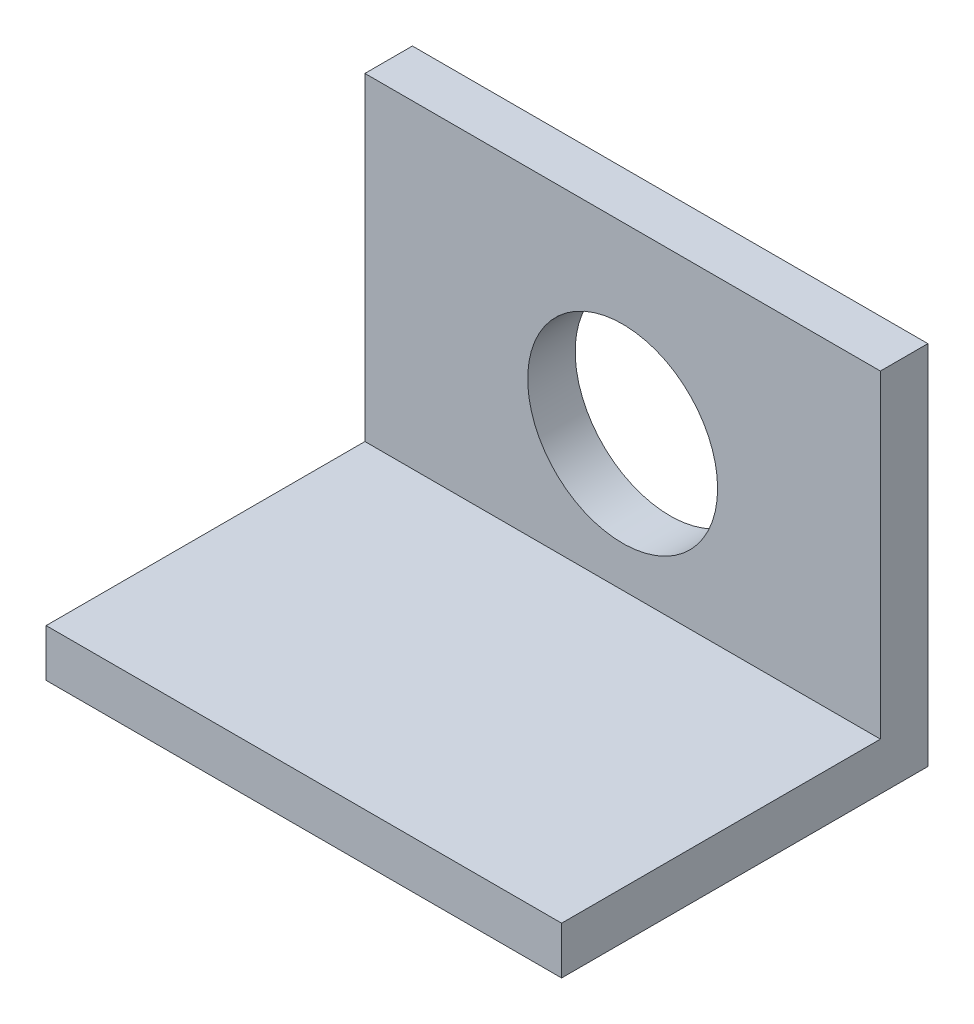
ISO-10303-21;
HEADER;
FILE_DESCRIPTION(('STEP AP214'),'2;1');
FILE_NAME('part.step','',(''),(''),'','','');
FILE_SCHEMA(('AUTOMOTIVE_DESIGN { 1 0 10303 214 1 1 1 1 }'));
ENDSEC;
DATA;
#1=APPLICATION_CONTEXT('core data for automotive mechanical design processes');
#2=APPLICATION_PROTOCOL_DEFINITION('international standard','automotive_design',2000,#1);
#3=PRODUCT_CONTEXT('',#1,'mechanical');
#4=PRODUCT('Part','Part','',(#3));
#5=PRODUCT_RELATED_PRODUCT_CATEGORY('part','',(#4));
#6=PRODUCT_DEFINITION_FORMATION('','',#4);
#7=PRODUCT_DEFINITION_CONTEXT('part definition',#1,'design');
#8=PRODUCT_DEFINITION('design','',#6,#7);
#9=PRODUCT_DEFINITION_SHAPE('','',#8);
#10=(LENGTH_UNIT() NAMED_UNIT(*) SI_UNIT(.MILLI.,.METRE.));
#11=(NAMED_UNIT(*) PLANE_ANGLE_UNIT() SI_UNIT($,.RADIAN.));
#12=(NAMED_UNIT(*) SI_UNIT($,.STERADIAN.) SOLID_ANGLE_UNIT());
#13=UNCERTAINTY_MEASURE_WITH_UNIT(LENGTH_MEASURE(1.E-05),#10,'distance_accuracy_value','');
#14=(GEOMETRIC_REPRESENTATION_CONTEXT(3) GLOBAL_UNCERTAINTY_ASSIGNED_CONTEXT((#13)) GLOBAL_UNIT_ASSIGNED_CONTEXT((#10,
#11,#12)) REPRESENTATION_CONTEXT('',''));
#15=CARTESIAN_POINT('',(0.,0.,0.));
#16=DIRECTION('',(0.,0.,1.));
#17=DIRECTION('',(1.,0.,0.));
#18=AXIS2_PLACEMENT_3D('',#15,#16,#17);
#19=CARTESIAN_POINT('',(19.,0.,3.5));
#20=DIRECTION('',(1.,0.,0.));
#21=DIRECTION('',(0.,1.,0.));
#22=AXIS2_PLACEMENT_3D('',#19,#20,#21);
#23=PLANE('',#22);
#24=DIRECTION('',(0.,-1.,0.));
#25=VECTOR('',#24,1.);
#26=CARTESIAN_POINT('',(19.,0.,0.));
#27=LINE('',#26,#25);
#28=CARTESIAN_POINT('',(19.,27.,0.));
#29=VERTEX_POINT('',#28);
#30=CARTESIAN_POINT('',(19.,0.,0.));
#31=VERTEX_POINT('',#30);
#32=EDGE_CURVE('E83',#29,#31,#27,.T.);
#33=ORIENTED_EDGE('',*,*,#32,.F.);
#34=DIRECTION('',(0.,0.,-1.));
#35=VECTOR('',#34,1.);
#36=CARTESIAN_POINT('',(19.,27.,3.5));
#37=LINE('',#36,#35);
#38=CARTESIAN_POINT('',(19.,27.,3.5));
#39=VERTEX_POINT('',#38);
#40=EDGE_CURVE('E11',#39,#29,#37,.T.);
#41=ORIENTED_EDGE('',*,*,#40,.F.);
#42=DIRECTION('',(0.,-1.,0.));
#43=VECTOR('',#42,1.);
#44=CARTESIAN_POINT('',(19.,0.,3.5));
#45=LINE('',#44,#43);
#46=CARTESIAN_POINT('',(19.,3.5,3.5));
#47=VERTEX_POINT('',#46);
#48=EDGE_CURVE('E80',#39,#47,#45,.T.);
#49=ORIENTED_EDGE('',*,*,#48,.T.);
#50=DIRECTION('',(0.,0.,-1.));
#51=VECTOR('',#50,1.);
#52=CARTESIAN_POINT('',(19.,3.5,27.));
#53=LINE('',#52,#51);
#54=CARTESIAN_POINT('',(19.,3.5,27.));
#55=VERTEX_POINT('',#54);
#56=EDGE_CURVE('E52',#55,#47,#53,.T.);
#57=ORIENTED_EDGE('',*,*,#56,.F.);
#58=DIRECTION('',(0.,-1.,0.));
#59=VECTOR('',#58,1.);
#60=CARTESIAN_POINT('',(19.,0.,27.));
#61=LINE('',#60,#59);
#62=CARTESIAN_POINT('',(19.,0.,27.));
#63=VERTEX_POINT('',#62);
#64=EDGE_CURVE('E121',#55,#63,#61,.T.);
#65=ORIENTED_EDGE('',*,*,#64,.T.);
#66=DIRECTION('',(0.,0.,-1.));
#67=VECTOR('',#66,1.);
#68=CARTESIAN_POINT('',(19.,0.,27.));
#69=LINE('',#68,#67);
#70=EDGE_CURVE('E130',#63,#31,#69,.T.);
#71=ORIENTED_EDGE('',*,*,#70,.T.);
#72=EDGE_LOOP('',(#33,#41,#49,#57,#65,#71));
#73=FACE_BOUND('',#72,.T.);
#74=ADVANCED_FACE('F35',(#73),#23,.T.);
#75=CARTESIAN_POINT('',(0.,27.,3.5));
#76=DIRECTION('',(0.,1.,0.));
#77=DIRECTION('',(0.,0.,1.));
#78=AXIS2_PLACEMENT_3D('',#75,#76,#77);
#79=PLANE('',#78);
#80=DIRECTION('',(1.,0.,0.));
#81=VECTOR('',#80,1.);
#82=CARTESIAN_POINT('',(0.,27.,0.));
#83=LINE('',#82,#81);
#84=CARTESIAN_POINT('',(-19.,27.,0.));
#85=VERTEX_POINT('',#84);
#86=EDGE_CURVE('E104',#85,#29,#83,.T.);
#87=ORIENTED_EDGE('',*,*,#86,.F.);
#88=DIRECTION('',(0.,0.,-1.));
#89=VECTOR('',#88,1.);
#90=CARTESIAN_POINT('',(-19.,27.,3.5));
#91=LINE('',#90,#89);
#92=CARTESIAN_POINT('',(-19.,27.,3.5));
#93=VERTEX_POINT('',#92);
#94=EDGE_CURVE('E44',#93,#85,#91,.T.);
#95=ORIENTED_EDGE('',*,*,#94,.F.);
#96=DIRECTION('',(1.,0.,0.));
#97=VECTOR('',#96,1.);
#98=CARTESIAN_POINT('',(0.,27.,3.5));
#99=LINE('',#98,#97);
#100=EDGE_CURVE('E89',#93,#39,#99,.T.);
#101=ORIENTED_EDGE('',*,*,#100,.T.);
#102=ORIENTED_EDGE('',*,*,#40,.T.);
#103=EDGE_LOOP('',(#87,#95,#101,#102));
#104=FACE_BOUND('',#103,.T.);
#105=ADVANCED_FACE('F92',(#104),#79,.T.);
#106=CARTESIAN_POINT('',(-19.,0.,3.5));
#107=DIRECTION('',(1.,0.,0.));
#108=DIRECTION('',(0.,0.,-1.));
#109=AXIS2_PLACEMENT_3D('',#106,#107,#108);
#110=PLANE('',#109);
#111=DIRECTION('',(0.,-1.,0.));
#112=VECTOR('',#111,1.);
#113=CARTESIAN_POINT('',(-19.,0.,0.));
#114=LINE('',#113,#112);
#115=CARTESIAN_POINT('',(-19.,0.,0.));
#116=VERTEX_POINT('',#115);
#117=EDGE_CURVE('E106',#85,#116,#114,.T.);
#118=ORIENTED_EDGE('',*,*,#117,.T.);
#119=DIRECTION('',(0.,0.,-1.));
#120=VECTOR('',#119,1.);
#121=CARTESIAN_POINT('',(-19.,0.,27.));
#122=LINE('',#121,#120);
#123=CARTESIAN_POINT('',(-19.,0.,27.));
#124=VERTEX_POINT('',#123);
#125=EDGE_CURVE('E132',#124,#116,#122,.T.);
#126=ORIENTED_EDGE('',*,*,#125,.F.);
#127=DIRECTION('',(0.,-1.,0.));
#128=VECTOR('',#127,1.);
#129=CARTESIAN_POINT('',(-19.,0.,27.));
#130=LINE('',#129,#128);
#131=CARTESIAN_POINT('',(-19.,3.5,27.));
#132=VERTEX_POINT('',#131);
#133=EDGE_CURVE('E228',#132,#124,#130,.T.);
#134=ORIENTED_EDGE('',*,*,#133,.F.);
#135=DIRECTION('',(0.,0.,-1.));
#136=VECTOR('',#135,1.);
#137=CARTESIAN_POINT('',(-19.,3.5,27.));
#138=LINE('',#137,#136);
#139=CARTESIAN_POINT('',(-19.,3.5,3.5));
#140=VERTEX_POINT('',#139);
#141=EDGE_CURVE('E134',#132,#140,#138,.T.);
#142=ORIENTED_EDGE('',*,*,#141,.T.);
#143=DIRECTION('',(0.,-1.,0.));
#144=VECTOR('',#143,1.);
#145=CARTESIAN_POINT('',(-19.,0.,3.5));
#146=LINE('',#145,#144);
#147=EDGE_CURVE('E94',#93,#140,#146,.T.);
#148=ORIENTED_EDGE('',*,*,#147,.F.);
#149=ORIENTED_EDGE('',*,*,#94,.T.);
#150=EDGE_LOOP('',(#118,#126,#134,#142,#148,#149));
#151=FACE_BOUND('',#150,.T.);
#152=ADVANCED_FACE('F110',(#151),#110,.F.);
#153=CARTESIAN_POINT('',(0.,13.5,3.5));
#154=DIRECTION('',(0.,0.,-1.));
#155=DIRECTION('',(-1.,0.,0.));
#156=AXIS2_PLACEMENT_3D('',#153,#154,#155);
#157=CYLINDRICAL_SURFACE('',#156,7.);
#158=CARTESIAN_POINT('',(0.,13.5,3.5));
#159=DIRECTION('',(0.,0.,1.));
#160=DIRECTION('',(1.,0.,0.));
#161=AXIS2_PLACEMENT_3D('',#158,#159,#160);
#162=CIRCLE('',#161,7.);
#163=CARTESIAN_POINT('',(7.,13.5,3.5));
#164=VERTEX_POINT('',#163);
#165=EDGE_CURVE('E90',#164,#164,#162,.T.);
#166=ORIENTED_EDGE('',*,*,#165,.T.);
#167=EDGE_LOOP('',(#166));
#168=FACE_BOUND('',#167,.T.);
#169=CARTESIAN_POINT('',(0.,13.5,0.));
#170=DIRECTION('',(0.,0.,1.));
#171=DIRECTION('',(1.,0.,0.));
#172=AXIS2_PLACEMENT_3D('',#169,#170,#171);
#173=CIRCLE('',#172,7.);
#174=CARTESIAN_POINT('',(7.,13.5,0.));
#175=VERTEX_POINT('',#174);
#176=EDGE_CURVE('E100',#175,#175,#173,.T.);
#177=ORIENTED_EDGE('',*,*,#176,.F.);
#178=EDGE_LOOP('',(#177));
#179=FACE_BOUND('',#178,.T.);
#180=ADVANCED_FACE('F37',(#168,#179),#157,.F.);
#181=CARTESIAN_POINT('',(0.,0.,3.5));
#182=DIRECTION('',(0.,0.,1.));
#183=DIRECTION('',(1.,0.,0.));
#184=AXIS2_PLACEMENT_3D('',#181,#182,#183);
#185=PLANE('',#184);
#186=ORIENTED_EDGE('',*,*,#165,.F.);
#187=EDGE_LOOP('',(#186));
#188=FACE_BOUND('',#187,.T.);
#189=ORIENTED_EDGE('',*,*,#48,.F.);
#190=ORIENTED_EDGE('',*,*,#100,.F.);
#191=ORIENTED_EDGE('',*,*,#147,.T.);
#192=DIRECTION('',(1.,0.,0.));
#193=VECTOR('',#192,1.);
#194=CARTESIAN_POINT('',(0.,3.5,3.5));
#195=LINE('',#194,#193);
#196=EDGE_CURVE('E69',#140,#47,#195,.T.);
#197=ORIENTED_EDGE('',*,*,#196,.T.);
#198=EDGE_LOOP('',(#189,#190,#191,#197));
#199=FACE_BOUND('',#198,.T.);
#200=ADVANCED_FACE('F87',(#188,#199),#185,.T.);
#201=CARTESIAN_POINT('',(0.,0.,0.));
#202=DIRECTION('',(0.,0.,1.));
#203=DIRECTION('',(1.,0.,0.));
#204=AXIS2_PLACEMENT_3D('',#201,#202,#203);
#205=PLANE('',#204);
#206=ORIENTED_EDGE('',*,*,#176,.T.);
#207=EDGE_LOOP('',(#206));
#208=FACE_BOUND('',#207,.T.);
#209=ORIENTED_EDGE('',*,*,#32,.T.);
#210=DIRECTION('',(1.,0.,0.));
#211=VECTOR('',#210,1.);
#212=CARTESIAN_POINT('',(0.,0.,0.));
#213=LINE('',#212,#211);
#214=EDGE_CURVE('E118',#116,#31,#213,.T.);
#215=ORIENTED_EDGE('',*,*,#214,.F.);
#216=ORIENTED_EDGE('',*,*,#117,.F.);
#217=ORIENTED_EDGE('',*,*,#86,.T.);
#218=EDGE_LOOP('',(#209,#215,#216,#217));
#219=FACE_BOUND('',#218,.T.);
#220=ADVANCED_FACE('F116',(#208,#219),#205,.F.);
#221=CARTESIAN_POINT('',(0.,3.5,27.));
#222=DIRECTION('',(0.,1.,0.));
#223=DIRECTION('',(0.,0.,1.));
#224=AXIS2_PLACEMENT_3D('',#221,#222,#223);
#225=PLANE('',#224);
#226=ORIENTED_EDGE('',*,*,#196,.F.);
#227=ORIENTED_EDGE('',*,*,#141,.F.);
#228=DIRECTION('',(1.,0.,0.));
#229=VECTOR('',#228,1.);
#230=CARTESIAN_POINT('',(0.,3.5,27.));
#231=LINE('',#230,#229);
#232=EDGE_CURVE('E124',#132,#55,#231,.T.);
#233=ORIENTED_EDGE('',*,*,#232,.T.);
#234=ORIENTED_EDGE('',*,*,#56,.T.);
#235=EDGE_LOOP('',(#226,#227,#233,#234));
#236=FACE_BOUND('',#235,.T.);
#237=ADVANCED_FACE('F147',(#236),#225,.T.);
#238=CARTESIAN_POINT('',(0.,0.,27.));
#239=DIRECTION('',(0.,1.,0.));
#240=DIRECTION('',(0.,0.,1.));
#241=AXIS2_PLACEMENT_3D('',#238,#239,#240);
#242=PLANE('',#241);
#243=ORIENTED_EDGE('',*,*,#214,.T.);
#244=ORIENTED_EDGE('',*,*,#70,.F.);
#245=DIRECTION('',(1.,0.,0.));
#246=VECTOR('',#245,1.);
#247=CARTESIAN_POINT('',(0.,0.,27.));
#248=LINE('',#247,#246);
#249=EDGE_CURVE('E128',#124,#63,#248,.T.);
#250=ORIENTED_EDGE('',*,*,#249,.F.);
#251=ORIENTED_EDGE('',*,*,#125,.T.);
#252=EDGE_LOOP('',(#243,#244,#250,#251));
#253=FACE_BOUND('',#252,.T.);
#254=ADVANCED_FACE('F199',(#253),#242,.F.);
#255=CARTESIAN_POINT('',(0.,0.,27.));
#256=DIRECTION('',(0.,0.,1.));
#257=DIRECTION('',(1.,0.,0.));
#258=AXIS2_PLACEMENT_3D('',#255,#256,#257);
#259=PLANE('',#258);
#260=ORIENTED_EDGE('',*,*,#64,.F.);
#261=ORIENTED_EDGE('',*,*,#232,.F.);
#262=ORIENTED_EDGE('',*,*,#133,.T.);
#263=ORIENTED_EDGE('',*,*,#249,.T.);
#264=EDGE_LOOP('',(#260,#261,#262,#263));
#265=FACE_BOUND('',#264,.T.);
#266=ADVANCED_FACE('F206',(#265),#259,.T.);
#267=CLOSED_SHELL('',(#74,#105,#152,#180,#200,#220,#237,#254,#266));
#268=MANIFOLD_SOLID_BREP('B2',#267);
#269=ADVANCED_BREP_SHAPE_REPRESENTATION('',(#18,#268),#14);
#270=SHAPE_DEFINITION_REPRESENTATION(#9,#269);
ENDSEC;
END-ISO-10303-21;
